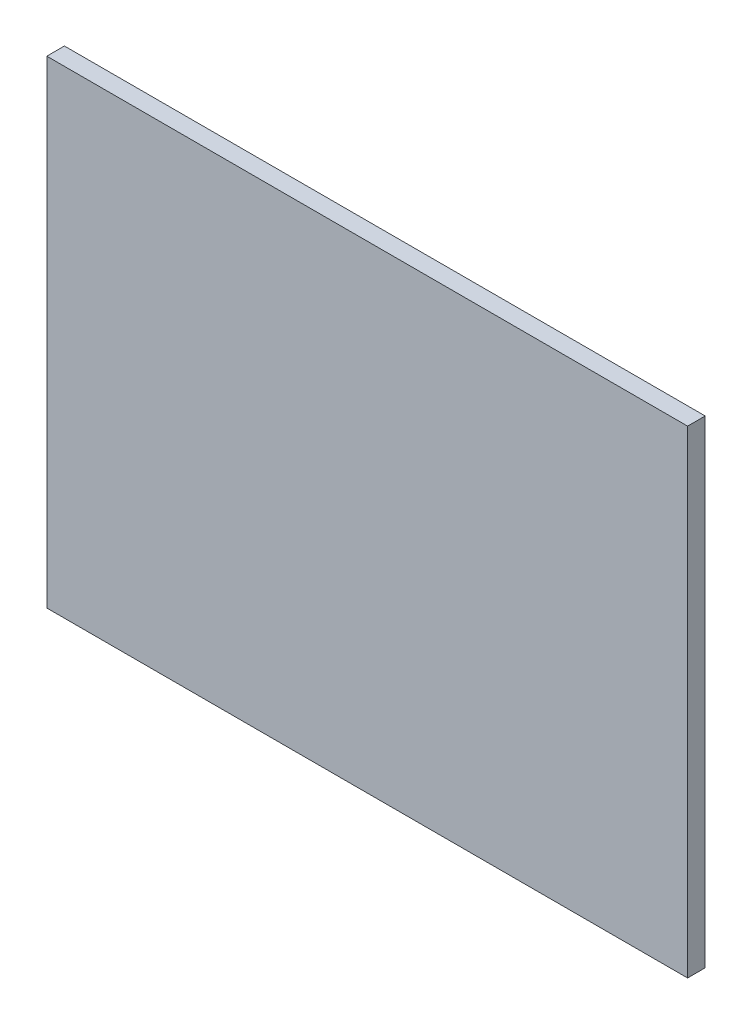
ISO-10303-21;
HEADER;
FILE_DESCRIPTION(('STEP AP214'),'2;1');
FILE_NAME('part.step','',(''),(''),'','','');
FILE_SCHEMA(('AUTOMOTIVE_DESIGN { 1 0 10303 214 1 1 1 1 }'));
ENDSEC;
DATA;
#1=APPLICATION_CONTEXT('core data for automotive mechanical design processes');
#2=APPLICATION_PROTOCOL_DEFINITION('international standard','automotive_design',2000,#1);
#3=PRODUCT_CONTEXT('',#1,'mechanical');
#4=PRODUCT('Part','Part','',(#3));
#5=PRODUCT_RELATED_PRODUCT_CATEGORY('part','',(#4));
#6=PRODUCT_DEFINITION_FORMATION('','',#4);
#7=PRODUCT_DEFINITION_CONTEXT('part definition',#1,'design');
#8=PRODUCT_DEFINITION('design','',#6,#7);
#9=PRODUCT_DEFINITION_SHAPE('','',#8);
#10=(LENGTH_UNIT() NAMED_UNIT(*) SI_UNIT(.MILLI.,.METRE.));
#11=(NAMED_UNIT(*) PLANE_ANGLE_UNIT() SI_UNIT($,.RADIAN.));
#12=(NAMED_UNIT(*) SI_UNIT($,.STERADIAN.) SOLID_ANGLE_UNIT());
#13=UNCERTAINTY_MEASURE_WITH_UNIT(LENGTH_MEASURE(1.E-05),#10,'distance_accuracy_value','');
#14=(GEOMETRIC_REPRESENTATION_CONTEXT(3) GLOBAL_UNCERTAINTY_ASSIGNED_CONTEXT((#13)) GLOBAL_UNIT_ASSIGNED_CONTEXT((#10,
#11,#12)) REPRESENTATION_CONTEXT('',''));
#15=CARTESIAN_POINT('',(0.,0.,0.));
#16=DIRECTION('',(0.,0.,1.));
#17=DIRECTION('',(1.,0.,0.));
#18=AXIS2_PLACEMENT_3D('',#15,#16,#17);
#19=CARTESIAN_POINT('',(1.724725,-0.132775,0.05));
#20=DIRECTION('',(-1.,0.,0.));
#21=DIRECTION('',(0.,0.,1.));
#22=AXIS2_PLACEMENT_3D('',#19,#20,#21);
#23=PLANE('',#22);
#24=DIRECTION('',(0.,0.,-1.));
#25=VECTOR('',#24,1.);
#26=CARTESIAN_POINT('',(1.724725,-1.490275,0.05));
#27=LINE('',#26,#25);
#28=CARTESIAN_POINT('',(1.724725,-1.490275,0.1));
#29=VERTEX_POINT('',#28);
#30=CARTESIAN_POINT('',(1.724725,-1.490275,0.));
#31=VERTEX_POINT('',#30);
#32=EDGE_CURVE('E100',#29,#31,#27,.T.);
#33=ORIENTED_EDGE('',*,*,#32,.T.);
#34=DIRECTION('',(0.,-1.,0.));
#35=VECTOR('',#34,1.);
#36=CARTESIAN_POINT('',(1.724725,-0.132775,0.));
#37=LINE('',#36,#35);
#38=CARTESIAN_POINT('',(1.724725,1.224725,0.));
#39=VERTEX_POINT('',#38);
#40=EDGE_CURVE('E75',#39,#31,#37,.T.);
#41=ORIENTED_EDGE('',*,*,#40,.F.);
#42=DIRECTION('',(0.,0.,-1.));
#43=VECTOR('',#42,1.);
#44=CARTESIAN_POINT('',(1.724725,1.224725,0.05));
#45=LINE('',#44,#43);
#46=CARTESIAN_POINT('',(1.724725,1.224725,0.1));
#47=VERTEX_POINT('',#46);
#48=EDGE_CURVE('E11',#47,#39,#45,.T.);
#49=ORIENTED_EDGE('',*,*,#48,.F.);
#50=DIRECTION('',(0.,1.,0.));
#51=VECTOR('',#50,1.);
#52=CARTESIAN_POINT('',(1.724725,-0.132775,0.1));
#53=LINE('',#52,#51);
#54=EDGE_CURVE('E73',#29,#47,#53,.T.);
#55=ORIENTED_EDGE('',*,*,#54,.F.);
#56=EDGE_LOOP('',(#33,#41,#49,#55));
#57=FACE_BOUND('',#56,.T.);
#58=ADVANCED_FACE('F17',(#57),#23,.F.);
#59=CARTESIAN_POINT('',(-0.095275,1.224725,0.05));
#60=DIRECTION('',(0.,-1.,0.));
#61=DIRECTION('',(0.,0.,-1.));
#62=AXIS2_PLACEMENT_3D('',#59,#60,#61);
#63=PLANE('',#62);
#64=ORIENTED_EDGE('',*,*,#48,.T.);
#65=DIRECTION('',(1.,0.,0.));
#66=VECTOR('',#65,1.);
#67=CARTESIAN_POINT('',(-0.095275,1.224725,0.));
#68=LINE('',#67,#66);
#69=CARTESIAN_POINT('',(-1.915275,1.224725,0.));
#70=VERTEX_POINT('',#69);
#71=EDGE_CURVE('E107',#70,#39,#68,.T.);
#72=ORIENTED_EDGE('',*,*,#71,.F.);
#73=DIRECTION('',(0.,0.,-1.));
#74=VECTOR('',#73,1.);
#75=CARTESIAN_POINT('',(-1.915275,1.224725,0.05));
#76=LINE('',#75,#74);
#77=CARTESIAN_POINT('',(-1.915275,1.224725,0.1));
#78=VERTEX_POINT('',#77);
#79=EDGE_CURVE('E25',#78,#70,#76,.T.);
#80=ORIENTED_EDGE('',*,*,#79,.F.);
#81=DIRECTION('',(-1.,0.,0.));
#82=VECTOR('',#81,1.);
#83=CARTESIAN_POINT('',(-0.095275,1.224725,0.1));
#84=LINE('',#83,#82);
#85=EDGE_CURVE('E79',#47,#78,#84,.T.);
#86=ORIENTED_EDGE('',*,*,#85,.F.);
#87=EDGE_LOOP('',(#64,#72,#80,#86));
#88=FACE_BOUND('',#87,.T.);
#89=ADVANCED_FACE('F80',(#88),#63,.F.);
#90=CARTESIAN_POINT('',(-1.915275,-0.132775,0.05));
#91=DIRECTION('',(1.,0.,0.));
#92=DIRECTION('',(0.,1.,0.));
#93=AXIS2_PLACEMENT_3D('',#90,#91,#92);
#94=PLANE('',#93);
#95=ORIENTED_EDGE('',*,*,#79,.T.);
#96=DIRECTION('',(0.,1.,0.));
#97=VECTOR('',#96,1.);
#98=CARTESIAN_POINT('',(-1.915275,-0.132775,0.));
#99=LINE('',#98,#97);
#100=CARTESIAN_POINT('',(-1.915275,-1.490275,0.));
#101=VERTEX_POINT('',#100);
#102=EDGE_CURVE('E103',#101,#70,#99,.T.);
#103=ORIENTED_EDGE('',*,*,#102,.F.);
#104=DIRECTION('',(0.,0.,-1.));
#105=VECTOR('',#104,1.);
#106=CARTESIAN_POINT('',(-1.915275,-1.490275,0.05));
#107=LINE('',#106,#105);
#108=CARTESIAN_POINT('',(-1.915275,-1.490275,0.1));
#109=VERTEX_POINT('',#108);
#110=EDGE_CURVE('E46',#109,#101,#107,.T.);
#111=ORIENTED_EDGE('',*,*,#110,.F.);
#112=DIRECTION('',(0.,-1.,0.));
#113=VECTOR('',#112,1.);
#114=CARTESIAN_POINT('',(-1.915275,-0.132775,0.1));
#115=LINE('',#114,#113);
#116=EDGE_CURVE('E84',#78,#109,#115,.T.);
#117=ORIENTED_EDGE('',*,*,#116,.F.);
#118=EDGE_LOOP('',(#95,#103,#111,#117));
#119=FACE_BOUND('',#118,.T.);
#120=ADVANCED_FACE('F165',(#119),#94,.F.);
#121=CARTESIAN_POINT('',(-0.095275,-1.490275,0.05));
#122=DIRECTION('',(0.,1.,0.));
#123=DIRECTION('',(1.,0.,0.));
#124=AXIS2_PLACEMENT_3D('',#121,#122,#123);
#125=PLANE('',#124);
#126=ORIENTED_EDGE('',*,*,#110,.T.);
#127=DIRECTION('',(-1.,0.,0.));
#128=VECTOR('',#127,1.);
#129=CARTESIAN_POINT('',(-0.095275,-1.490275,0.));
#130=LINE('',#129,#128);
#131=EDGE_CURVE('E108',#31,#101,#130,.T.);
#132=ORIENTED_EDGE('',*,*,#131,.F.);
#133=ORIENTED_EDGE('',*,*,#32,.F.);
#134=DIRECTION('',(1.,0.,0.));
#135=VECTOR('',#134,1.);
#136=CARTESIAN_POINT('',(-0.095275,-1.490275,0.1));
#137=LINE('',#136,#135);
#138=EDGE_CURVE('E88',#109,#29,#137,.T.);
#139=ORIENTED_EDGE('',*,*,#138,.F.);
#140=EDGE_LOOP('',(#126,#132,#133,#139));
#141=FACE_BOUND('',#140,.T.);
#142=ADVANCED_FACE('F155',(#141),#125,.F.);
#143=CARTESIAN_POINT('',(-0.095275,-0.132775,0.));
#144=DIRECTION('',(0.,0.,1.));
#145=DIRECTION('',(1.,0.,0.));
#146=AXIS2_PLACEMENT_3D('',#143,#144,#145);
#147=PLANE('',#146);
#148=ORIENTED_EDGE('',*,*,#40,.T.);
#149=ORIENTED_EDGE('',*,*,#131,.T.);
#150=ORIENTED_EDGE('',*,*,#102,.T.);
#151=ORIENTED_EDGE('',*,*,#71,.T.);
#152=EDGE_LOOP('',(#148,#149,#150,#151));
#153=FACE_BOUND('',#152,.T.);
#154=ADVANCED_FACE('F143',(#153),#147,.F.);
#155=CARTESIAN_POINT('',(-0.095275,-0.132775,0.1));
#156=DIRECTION('',(0.,0.,1.));
#157=DIRECTION('',(1.,0.,0.));
#158=AXIS2_PLACEMENT_3D('',#155,#156,#157);
#159=PLANE('',#158);
#160=ORIENTED_EDGE('',*,*,#54,.T.);
#161=ORIENTED_EDGE('',*,*,#85,.T.);
#162=ORIENTED_EDGE('',*,*,#116,.T.);
#163=ORIENTED_EDGE('',*,*,#138,.T.);
#164=EDGE_LOOP('',(#160,#161,#162,#163));
#165=FACE_BOUND('',#164,.T.);
#166=ADVANCED_FACE('F87',(#165),#159,.T.);
#167=CLOSED_SHELL('',(#58,#89,#120,#142,#154,#166));
#168=MANIFOLD_SOLID_BREP('B1',#167);
#169=ADVANCED_BREP_SHAPE_REPRESENTATION('',(#18,#168),#14);
#170=SHAPE_DEFINITION_REPRESENTATION(#9,#169);
ENDSEC;
END-ISO-10303-21;
